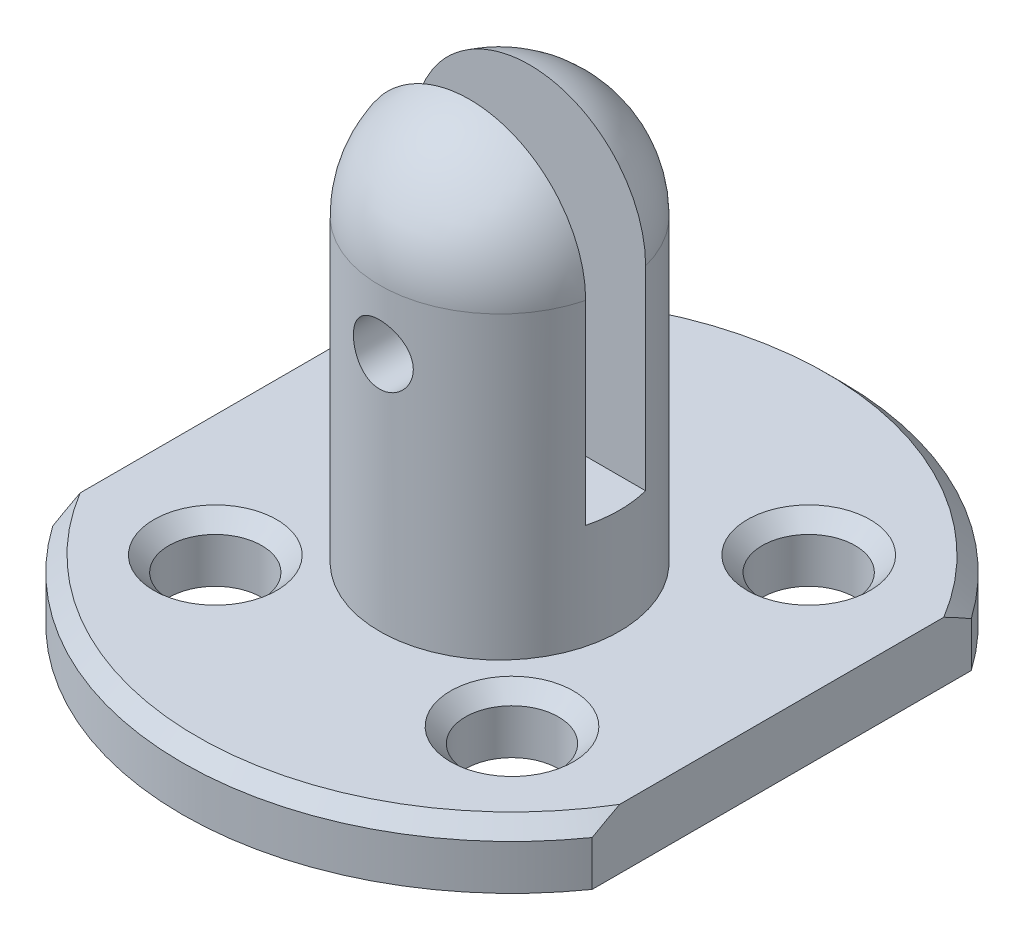
ISO-10303-21;
HEADER;
FILE_DESCRIPTION(('STEP AP214'),'2;1');
FILE_NAME('part.step','',(''),(''),'','','');
FILE_SCHEMA(('AUTOMOTIVE_DESIGN { 1 0 10303 214 1 1 1 1 }'));
ENDSEC;
DATA;
#1=APPLICATION_CONTEXT('core data for automotive mechanical design processes');
#2=APPLICATION_PROTOCOL_DEFINITION('international standard','automotive_design',2000,#1);
#3=PRODUCT_CONTEXT('',#1,'mechanical');
#4=PRODUCT('Part','Part','',(#3));
#5=PRODUCT_RELATED_PRODUCT_CATEGORY('part','',(#4));
#6=PRODUCT_DEFINITION_FORMATION('','',#4);
#7=PRODUCT_DEFINITION_CONTEXT('part definition',#1,'design');
#8=PRODUCT_DEFINITION('design','',#6,#7);
#9=PRODUCT_DEFINITION_SHAPE('','',#8);
#10=(LENGTH_UNIT() NAMED_UNIT(*) SI_UNIT(.MILLI.,.METRE.));
#11=(NAMED_UNIT(*) PLANE_ANGLE_UNIT() SI_UNIT($,.RADIAN.));
#12=(NAMED_UNIT(*) SI_UNIT($,.STERADIAN.) SOLID_ANGLE_UNIT());
#13=UNCERTAINTY_MEASURE_WITH_UNIT(LENGTH_MEASURE(1.E-05),#10,'distance_accuracy_value','');
#14=(GEOMETRIC_REPRESENTATION_CONTEXT(3) GLOBAL_UNCERTAINTY_ASSIGNED_CONTEXT((#13)) GLOBAL_UNIT_ASSIGNED_CONTEXT((#10,
#11,#12)) REPRESENTATION_CONTEXT('',''));
#15=CARTESIAN_POINT('',(0.,0.,0.));
#16=DIRECTION('',(0.,0.,1.));
#17=DIRECTION('',(1.,0.,0.));
#18=AXIS2_PLACEMENT_3D('',#15,#16,#17);
#19=CARTESIAN_POINT('',(5.3047232016726,12.,0.));
#20=DIRECTION('',(0.,1.,0.));
#21=DIRECTION('',(1.,0.,0.));
#22=AXIS2_PLACEMENT_3D('',#19,#20,#21);
#23=SPHERICAL_SURFACE('',#22,4.);
#24=CARTESIAN_POINT('',(5.3047232016726,12.,0.));
#25=DIRECTION('',(0.,1.,0.));
#26=DIRECTION('',(-1.,0.,0.));
#27=AXIS2_PLACEMENT_3D('',#24,#25,#26);
#28=CIRCLE('',#27,4.);
#29=CARTESIAN_POINT('',(9.17770654788001,12.,-1.));
#30=VERTEX_POINT('',#29);
#31=CARTESIAN_POINT('',(1.43173985546518,12.,-1.));
#32=VERTEX_POINT('',#31);
#33=EDGE_CURVE('E146',#30,#32,#28,.T.);
#34=ORIENTED_EDGE('',*,*,#33,.T.);
#35=CARTESIAN_POINT('',(5.3047232016726,12.,-1.));
#36=DIRECTION('',(0.,0.,-1.));
#37=DIRECTION('',(0.,1.,0.));
#38=AXIS2_PLACEMENT_3D('',#35,#36,#37);
#39=CIRCLE('',#38,3.87298334620742);
#40=EDGE_CURVE('E124',#32,#30,#39,.T.);
#41=ORIENTED_EDGE('',*,*,#40,.T.);
#42=EDGE_LOOP('',(#34,#41));
#43=FACE_BOUND('',#42,.T.);
#44=ADVANCED_FACE('F35',(#43),#23,.T.);
#45=CARTESIAN_POINT('',(5.3047232016726,2.,-0.414125848088417));
#46=DIRECTION('',(0.,-1.,0.));
#47=DIRECTION('',(0.,0.,-1.));
#48=AXIS2_PLACEMENT_3D('',#45,#46,#47);
#49=CYLINDRICAL_SURFACE('',#48,11.);
#50=DIRECTION('',(0.,-1.,0.));
#51=VECTOR('',#50,1.);
#52=CARTESIAN_POINT('',(-3.6952767983274,2.,-6.73868116842517));
#53=LINE('',#52,#51);
#54=CARTESIAN_POINT('',(-3.6952767983274,1.5,-6.73868116842517));
#55=VERTEX_POINT('',#54);
#56=CARTESIAN_POINT('',(-3.6952767983274,0.,-6.73868116842517));
#57=VERTEX_POINT('',#56);
#58=EDGE_CURVE('E187',#55,#57,#53,.T.);
#59=ORIENTED_EDGE('',*,*,#58,.F.);
#60=CARTESIAN_POINT('',(5.3047232016726,1.5,-0.414125848088417));
#61=DIRECTION('',(0.,1.,0.));
#62=DIRECTION('',(0.,0.,1.));
#63=AXIS2_PLACEMENT_3D('',#60,#61,#62);
#64=CIRCLE('',#63,11.);
#65=CARTESIAN_POINT('',(14.3047232016726,1.5,-6.73868116842518));
#66=VERTEX_POINT('',#65);
#67=EDGE_CURVE('E313',#55,#66,#64,.F.);
#68=ORIENTED_EDGE('',*,*,#67,.T.);
#69=DIRECTION('',(0.,-1.,0.));
#70=VECTOR('',#69,1.);
#71=CARTESIAN_POINT('',(14.3047232016726,2.,-6.73868116842518));
#72=LINE('',#71,#70);
#73=CARTESIAN_POINT('',(14.3047232016726,0.,-6.73868116842518));
#74=VERTEX_POINT('',#73);
#75=EDGE_CURVE('E171',#66,#74,#72,.T.);
#76=ORIENTED_EDGE('',*,*,#75,.T.);
#77=CARTESIAN_POINT('',(5.3047232016726,0.,-0.414125848088417));
#78=DIRECTION('',(0.,1.,0.));
#79=DIRECTION('',(0.,0.,1.));
#80=AXIS2_PLACEMENT_3D('',#77,#78,#79);
#81=CIRCLE('',#80,11.);
#82=EDGE_CURVE('E163',#74,#57,#81,.T.);
#83=ORIENTED_EDGE('',*,*,#82,.T.);
#84=EDGE_LOOP('',(#59,#68,#76,#83));
#85=FACE_BOUND('',#84,.T.);
#86=ADVANCED_FACE('F245',(#85),#49,.T.);
#87=CARTESIAN_POINT('',(-3.6952767983274,2.,5.91042947224834));
#88=DIRECTION('',(1.,0.,0.));
#89=DIRECTION('',(0.,0.,-1.));
#90=AXIS2_PLACEMENT_3D('',#87,#88,#89);
#91=PLANE('',#90);
#92=DIRECTION('',(0.,-1.,0.));
#93=VECTOR('',#92,1.);
#94=CARTESIAN_POINT('',(-3.69527679832741,2.,5.91042947224834));
#95=LINE('',#94,#93);
#96=CARTESIAN_POINT('',(-3.69527679832741,1.5,5.91042947224834));
#97=VERTEX_POINT('',#96);
#98=CARTESIAN_POINT('',(-3.69527679832741,0.,5.91042947224834));
#99=VERTEX_POINT('',#98);
#100=EDGE_CURVE('E185',#97,#99,#95,.T.);
#101=ORIENTED_EDGE('',*,*,#100,.F.);
#102=CARTESIAN_POINT('',(-3.69527679832741,1.5,5.91042947224834));
#103=CARTESIAN_POINT('',(-3.6952767983274,1.54336144120015,5.83501202660493));
#104=CARTESIAN_POINT('',(-3.6952767983274,1.58633376454159,5.75937019944279));
#105=CARTESIAN_POINT('',(-3.6952767983274,1.67144422351645,5.60763201809686));
#106=CARTESIAN_POINT('',(-3.6952767983274,1.71358246931803,5.53153572569244));
#107=CARTESIAN_POINT('',(-3.6952767983274,1.79698078713672,5.37886205559762));
#108=CARTESIAN_POINT('',(-3.6952767983274,1.83824085057838,5.30228467321883));
#109=CARTESIAN_POINT('',(-3.6952767983274,1.91983232897874,5.14862384085883));
#110=CARTESIAN_POINT('',(-3.6952767983274,1.96016361969474,5.07154032492386));
#111=CARTESIAN_POINT('',(-3.6952767983274,2.00000000000012,4.99420106510763));
#112=B_SPLINE_CURVE_WITH_KNOTS('',3,(#102,#103,#104,#105,#106,#107,#108,#109,#110,#111),
.UNSPECIFIED.,.F.,.F.,(4,2,2,2,4),(0.,0.260982516626926,0.521930328496994,0.782880687352906,
1.04386575332712),.UNSPECIFIED.);
#113=CARTESIAN_POINT('',(-3.6952767983274,2.,4.99420106510757));
#114=VERTEX_POINT('',#113);
#115=EDGE_CURVE('E254',#97,#114,#112,.T.);
#116=ORIENTED_EDGE('',*,*,#115,.T.);
#117=DIRECTION('',(0.,0.,1.));
#118=VECTOR('',#117,1.);
#119=CARTESIAN_POINT('',(-3.6952767983274,2.,5.91042947224834));
#120=LINE('',#119,#118);
#121=CARTESIAN_POINT('',(-3.6952767983274,2.,-5.8224527612844));
#122=VERTEX_POINT('',#121);
#123=EDGE_CURVE('E164',#122,#114,#120,.T.);
#124=ORIENTED_EDGE('',*,*,#123,.F.);
#125=CARTESIAN_POINT('',(-3.6952767983274,2.,-5.8224527612844));
#126=CARTESIAN_POINT('',(-3.6952767983274,1.9601636196947,-5.89979202110066));
#127=CARTESIAN_POINT('',(-3.6952767983274,1.91983232897873,-5.97687553703565));
#128=CARTESIAN_POINT('',(-3.6952767983274,1.8382408505784,-6.13053636939567));
#129=CARTESIAN_POINT('',(-3.6952767983274,1.79698078713673,-6.20711375177446));
#130=CARTESIAN_POINT('',(-3.6952767983274,1.71358246931802,-6.35978742186927));
#131=CARTESIAN_POINT('',(-3.6952767983274,1.67144422351644,-6.43588371427369));
#132=CARTESIAN_POINT('',(-3.6952767983274,1.5863337645416,-6.58762189561962));
#133=CARTESIAN_POINT('',(-3.6952767983274,1.54336144120018,-6.66326372278178));
#134=CARTESIAN_POINT('',(-3.6952767983274,1.50000000000006,-6.7386811684252));
#135=B_SPLINE_CURVE_WITH_KNOTS('',3,(#125,#126,#127,#128,#129,#130,#131,#132,#133,#134),
.UNSPECIFIED.,.F.,.F.,(4,2,2,2,4),(0.,0.260985065974222,0.521935424830138,0.782883236700206,
1.04386575332713),.UNSPECIFIED.);
#136=EDGE_CURVE('E60',#122,#55,#135,.T.);
#137=ORIENTED_EDGE('',*,*,#136,.T.);
#138=ORIENTED_EDGE('',*,*,#58,.T.);
#139=DIRECTION('',(0.,0.,1.));
#140=VECTOR('',#139,1.);
#141=CARTESIAN_POINT('',(-3.6952767983274,0.,5.91042947224834));
#142=LINE('',#141,#140);
#143=EDGE_CURVE('E174',#57,#99,#142,.T.);
#144=ORIENTED_EDGE('',*,*,#143,.T.);
#145=EDGE_LOOP('',(#101,#116,#124,#137,#138,#144));
#146=FACE_BOUND('',#145,.T.);
#147=ADVANCED_FACE('F240',(#146),#91,.F.);
#148=CARTESIAN_POINT('',(5.3047232016726,2.,-0.414125848088417));
#149=DIRECTION('',(0.,-1.,0.));
#150=DIRECTION('',(0.,0.,-1.));
#151=AXIS2_PLACEMENT_3D('',#148,#149,#150);
#152=CYLINDRICAL_SURFACE('',#151,11.);
#153=DIRECTION('',(0.,-1.,0.));
#154=VECTOR('',#153,1.);
#155=CARTESIAN_POINT('',(14.3047232016726,2.,5.91042947224834));
#156=LINE('',#155,#154);
#157=CARTESIAN_POINT('',(14.3047232016726,1.5,5.91042947224834));
#158=VERTEX_POINT('',#157);
#159=CARTESIAN_POINT('',(14.3047232016726,0.,5.91042947224834));
#160=VERTEX_POINT('',#159);
#161=EDGE_CURVE('E183',#158,#160,#156,.T.);
#162=ORIENTED_EDGE('',*,*,#161,.F.);
#163=CARTESIAN_POINT('',(5.3047232016726,1.5,-0.414125848088417));
#164=DIRECTION('',(0.,1.,0.));
#165=DIRECTION('',(0.,0.,1.));
#166=AXIS2_PLACEMENT_3D('',#163,#164,#165);
#167=CIRCLE('',#166,11.);
#168=EDGE_CURVE('E556',#158,#97,#167,.F.);
#169=ORIENTED_EDGE('',*,*,#168,.T.);
#170=ORIENTED_EDGE('',*,*,#100,.T.);
#171=CARTESIAN_POINT('',(5.3047232016726,0.,-0.414125848088417));
#172=DIRECTION('',(0.,1.,0.));
#173=DIRECTION('',(0.,0.,1.));
#174=AXIS2_PLACEMENT_3D('',#171,#172,#173);
#175=CIRCLE('',#174,11.);
#176=EDGE_CURVE('E177',#99,#160,#175,.T.);
#177=ORIENTED_EDGE('',*,*,#176,.T.);
#178=EDGE_LOOP('',(#162,#169,#170,#177));
#179=FACE_BOUND('',#178,.T.);
#180=ADVANCED_FACE('F233',(#179),#152,.T.);
#181=CARTESIAN_POINT('',(14.3047232016726,2.,5.91042947224834));
#182=DIRECTION('',(-1.,0.,0.));
#183=DIRECTION('',(0.,0.,1.));
#184=AXIS2_PLACEMENT_3D('',#181,#182,#183);
#185=PLANE('',#184);
#186=DIRECTION('',(0.,0.,-1.));
#187=VECTOR('',#186,1.);
#188=CARTESIAN_POINT('',(14.3047232016726,2.,5.91042947224834));
#189=LINE('',#188,#187);
#190=CARTESIAN_POINT('',(14.3047232016726,2.,4.99420106510757));
#191=VERTEX_POINT('',#190);
#192=CARTESIAN_POINT('',(14.3047232016726,2.,-5.8224527612844));
#193=VERTEX_POINT('',#192);
#194=EDGE_CURVE('E167',#191,#193,#189,.T.);
#195=ORIENTED_EDGE('',*,*,#194,.F.);
#196=CARTESIAN_POINT('',(14.3047232016726,2.,4.99420106510757));
#197=CARTESIAN_POINT('',(14.3047232016726,1.9601636196947,5.07154032492384));
#198=CARTESIAN_POINT('',(14.3047232016726,1.91983232897873,5.14862384085882));
#199=CARTESIAN_POINT('',(14.3047232016726,1.8382408505784,5.30228467321885));
#200=CARTESIAN_POINT('',(14.3047232016726,1.79698078713673,5.37886205559763));
#201=CARTESIAN_POINT('',(14.3047232016726,1.71358246931802,5.53153572569244));
#202=CARTESIAN_POINT('',(14.3047232016726,1.67144422351644,5.60763201809687));
#203=CARTESIAN_POINT('',(14.3047232016726,1.5863337645416,5.7593701994428));
#204=CARTESIAN_POINT('',(14.3047232016726,1.54336144120018,5.83501202660495));
#205=CARTESIAN_POINT('',(14.3047232016726,1.50000000000006,5.91042947224837));
#206=B_SPLINE_CURVE_WITH_KNOTS('',3,(#196,#197,#198,#199,#200,#201,#202,#203,#204,#205),
.UNSPECIFIED.,.F.,.F.,(4,2,2,2,4),(0.,0.260985065974222,0.521935424830137,0.782883236700204,
1.04386575332713),.UNSPECIFIED.);
#207=EDGE_CURVE('E220',#191,#158,#206,.T.);
#208=ORIENTED_EDGE('',*,*,#207,.T.);
#209=ORIENTED_EDGE('',*,*,#161,.T.);
#210=DIRECTION('',(0.,0.,-1.));
#211=VECTOR('',#210,1.);
#212=CARTESIAN_POINT('',(14.3047232016726,0.,5.91042947224834));
#213=LINE('',#212,#211);
#214=EDGE_CURVE('E168',#160,#74,#213,.T.);
#215=ORIENTED_EDGE('',*,*,#214,.T.);
#216=ORIENTED_EDGE('',*,*,#75,.F.);
#217=CARTESIAN_POINT('',(14.3047232016726,1.5,-6.73868116842518));
#218=CARTESIAN_POINT('',(14.3047232016726,1.54336144120015,-6.66326372278177));
#219=CARTESIAN_POINT('',(14.3047232016726,1.58633376454159,-6.58762189561963));
#220=CARTESIAN_POINT('',(14.3047232016726,1.67144422351644,-6.4358837142737));
#221=CARTESIAN_POINT('',(14.3047232016726,1.71358246931803,-6.35978742186928));
#222=CARTESIAN_POINT('',(14.3047232016726,1.79698078713672,-6.20711375177446));
#223=CARTESIAN_POINT('',(14.3047232016726,1.83824085057838,-6.13053636939567));
#224=CARTESIAN_POINT('',(14.3047232016726,1.91983232897874,-5.97687553703567));
#225=CARTESIAN_POINT('',(14.3047232016726,1.96016361969474,-5.8997920211007));
#226=CARTESIAN_POINT('',(14.3047232016726,2.00000000000012,-5.82245276128447));
#227=B_SPLINE_CURVE_WITH_KNOTS('',3,(#217,#218,#219,#220,#221,#222,#223,#224,#225,#226),
.UNSPECIFIED.,.F.,.F.,(4,2,2,2,4),(0.,0.260982516626927,0.521930328496995,0.782880687352908,
1.04386575332713),.UNSPECIFIED.);
#228=EDGE_CURVE('E213',#66,#193,#227,.T.);
#229=ORIENTED_EDGE('',*,*,#228,.T.);
#230=EDGE_LOOP('',(#195,#208,#209,#215,#216,#229));
#231=FACE_BOUND('',#230,.T.);
#232=ADVANCED_FACE('F227',(#231),#185,.F.);
#233=CARTESIAN_POINT('',(5.3047232016726,2.,-0.414125848088417));
#234=DIRECTION('',(0.,1.,0.));
#235=DIRECTION('',(0.,0.,1.));
#236=AXIS2_PLACEMENT_3D('',#233,#234,#235);
#237=PLANE('',#236);
#238=CARTESIAN_POINT('',(5.3047232016726,2.,0.));
#239=DIRECTION('',(0.,1.,0.));
#240=DIRECTION('',(-1.,0.,0.));
#241=AXIS2_PLACEMENT_3D('',#238,#239,#240);
#242=CIRCLE('',#241,4.);
#243=CARTESIAN_POINT('',(1.3047232016726,2.,0.));
#244=VERTEX_POINT('',#243);
#245=EDGE_CURVE('E148',#244,#244,#242,.T.);
#246=ORIENTED_EDGE('',*,*,#245,.F.);
#247=EDGE_LOOP('',(#246));
#248=FACE_BOUND('',#247,.T.);
#249=CARTESIAN_POINT('',(0.35497573336682,2.,-5.36387331639417));
#250=DIRECTION('',(0.,1.,0.));
#251=DIRECTION('',(0.,0.,1.));
#252=AXIS2_PLACEMENT_3D('',#249,#250,#251);
#253=CIRCLE('',#252,2.05);
#254=CARTESIAN_POINT('',(0.35497573336682,2.,-3.31387331639417));
#255=VERTEX_POINT('',#254);
#256=EDGE_CURVE('E207',#255,#255,#253,.F.);
#257=ORIENTED_EDGE('',*,*,#256,.T.);
#258=EDGE_LOOP('',(#257));
#259=FACE_BOUND('',#258,.T.);
#260=CARTESIAN_POINT('',(10.2544706699785,2.,4.53562162021744));
#261=DIRECTION('',(0.,1.,0.));
#262=DIRECTION('',(0.,0.,1.));
#263=AXIS2_PLACEMENT_3D('',#260,#261,#262);
#264=CIRCLE('',#263,2.05);
#265=CARTESIAN_POINT('',(10.2544706699785,2.,6.58562162021744));
#266=VERTEX_POINT('',#265);
#267=EDGE_CURVE('E204',#266,#266,#264,.F.);
#268=ORIENTED_EDGE('',*,*,#267,.T.);
#269=EDGE_LOOP('',(#268));
#270=FACE_BOUND('',#269,.T.);
#271=CARTESIAN_POINT('',(0.354975733366854,2.,4.53562162021751));
#272=DIRECTION('',(0.,1.,0.));
#273=DIRECTION('',(0.,0.,1.));
#274=AXIS2_PLACEMENT_3D('',#271,#272,#273);
#275=CIRCLE('',#274,2.05);
#276=CARTESIAN_POINT('',(0.354975733366854,2.,6.58562162021751));
#277=VERTEX_POINT('',#276);
#278=EDGE_CURVE('E198',#277,#277,#275,.F.);
#279=ORIENTED_EDGE('',*,*,#278,.T.);
#280=EDGE_LOOP('',(#279));
#281=FACE_BOUND('',#280,.T.);
#282=CARTESIAN_POINT('',(10.2544706699784,2.,-5.36387331639424));
#283=DIRECTION('',(0.,1.,0.));
#284=DIRECTION('',(0.,0.,1.));
#285=AXIS2_PLACEMENT_3D('',#282,#283,#284);
#286=CIRCLE('',#285,2.05);
#287=CARTESIAN_POINT('',(10.2544706699784,2.,-3.31387331639424));
#288=VERTEX_POINT('',#287);
#289=EDGE_CURVE('E195',#288,#288,#286,.F.);
#290=ORIENTED_EDGE('',*,*,#289,.T.);
#291=EDGE_LOOP('',(#290));
#292=FACE_BOUND('',#291,.T.);
#293=ORIENTED_EDGE('',*,*,#123,.T.);
#294=CARTESIAN_POINT('',(5.3047232016726,2.,-0.414125848088417));
#295=DIRECTION('',(0.,1.,0.));
#296=DIRECTION('',(0.,0.,1.));
#297=AXIS2_PLACEMENT_3D('',#294,#295,#296);
#298=CIRCLE('',#297,10.5);
#299=EDGE_CURVE('E201',#114,#191,#298,.T.);
#300=ORIENTED_EDGE('',*,*,#299,.T.);
#301=ORIENTED_EDGE('',*,*,#194,.T.);
#302=CARTESIAN_POINT('',(5.3047232016726,2.,-0.414125848088417));
#303=DIRECTION('',(0.,1.,0.));
#304=DIRECTION('',(0.,0.,1.));
#305=AXIS2_PLACEMENT_3D('',#302,#303,#304);
#306=CIRCLE('',#305,10.5);
#307=EDGE_CURVE('E192',#193,#122,#306,.T.);
#308=ORIENTED_EDGE('',*,*,#307,.T.);
#309=EDGE_LOOP('',(#293,#300,#301,#308));
#310=FACE_BOUND('',#309,.T.);
#311=ADVANCED_FACE('F232',(#248,#259,#270,#281,#292,#310),#237,.T.);
#312=CARTESIAN_POINT('',(5.3047232016726,0.,-0.414125848088417));
#313=DIRECTION('',(0.,1.,0.));
#314=DIRECTION('',(0.,0.,1.));
#315=AXIS2_PLACEMENT_3D('',#312,#313,#314);
#316=PLANE('',#315);
#317=CARTESIAN_POINT('',(5.3047232016726,0.,-0.414125848088417));
#318=DIRECTION('',(0.,1.,0.));
#319=DIRECTION('',(0.,0.,1.));
#320=AXIS2_PLACEMENT_3D('',#317,#318,#319);
#321=CIRCLE('',#320,3.);
#322=CARTESIAN_POINT('',(5.3047232016726,0.,2.58587415191158));
#323=VERTEX_POINT('',#322);
#324=EDGE_CURVE('E11',#323,#323,#321,.F.);
#325=ORIENTED_EDGE('',*,*,#324,.F.);
#326=EDGE_LOOP('',(#325));
#327=FACE_BOUND('',#326,.T.);
#328=CARTESIAN_POINT('',(0.35497573336682,0.,-5.36387331639417));
#329=DIRECTION('',(0.,1.,0.));
#330=DIRECTION('',(0.,0.,1.));
#331=AXIS2_PLACEMENT_3D('',#328,#329,#330);
#332=CIRCLE('',#331,1.55);
#333=CARTESIAN_POINT('',(0.35497573336682,0.,-3.81387331639417));
#334=VERTEX_POINT('',#333);
#335=EDGE_CURVE('E151',#334,#334,#332,.T.);
#336=ORIENTED_EDGE('',*,*,#335,.T.);
#337=EDGE_LOOP('',(#336));
#338=FACE_BOUND('',#337,.T.);
#339=CARTESIAN_POINT('',(0.354975733366854,0.,4.53562162021751));
#340=DIRECTION('',(0.,1.,0.));
#341=DIRECTION('',(0.,0.,1.));
#342=AXIS2_PLACEMENT_3D('',#339,#340,#341);
#343=CIRCLE('',#342,1.55);
#344=CARTESIAN_POINT('',(0.354975733366854,0.,6.08562162021751));
#345=VERTEX_POINT('',#344);
#346=EDGE_CURVE('E156',#345,#345,#343,.T.);
#347=ORIENTED_EDGE('',*,*,#346,.T.);
#348=EDGE_LOOP('',(#347));
#349=FACE_BOUND('',#348,.T.);
#350=CARTESIAN_POINT('',(10.2544706699785,0.,4.53562162021744));
#351=DIRECTION('',(0.,1.,0.));
#352=DIRECTION('',(0.,0.,1.));
#353=AXIS2_PLACEMENT_3D('',#350,#351,#352);
#354=CIRCLE('',#353,1.55);
#355=CARTESIAN_POINT('',(10.2544706699785,0.,6.08562162021744));
#356=VERTEX_POINT('',#355);
#357=EDGE_CURVE('E152',#356,#356,#354,.T.);
#358=ORIENTED_EDGE('',*,*,#357,.T.);
#359=EDGE_LOOP('',(#358));
#360=FACE_BOUND('',#359,.T.);
#361=CARTESIAN_POINT('',(10.2544706699784,0.,-5.36387331639424));
#362=DIRECTION('',(0.,1.,0.));
#363=DIRECTION('',(0.,0.,1.));
#364=AXIS2_PLACEMENT_3D('',#361,#362,#363);
#365=CIRCLE('',#364,1.55);
#366=CARTESIAN_POINT('',(10.2544706699784,0.,-3.81387331639424));
#367=VERTEX_POINT('',#366);
#368=EDGE_CURVE('E155',#367,#367,#365,.T.);
#369=ORIENTED_EDGE('',*,*,#368,.T.);
#370=EDGE_LOOP('',(#369));
#371=FACE_BOUND('',#370,.T.);
#372=ORIENTED_EDGE('',*,*,#82,.F.);
#373=ORIENTED_EDGE('',*,*,#214,.F.);
#374=ORIENTED_EDGE('',*,*,#176,.F.);
#375=ORIENTED_EDGE('',*,*,#143,.F.);
#376=EDGE_LOOP('',(#372,#373,#374,#375));
#377=FACE_BOUND('',#376,.T.);
#378=ADVANCED_FACE('F235',(#327,#338,#349,#360,#371,#377),#316,.F.);
#379=CARTESIAN_POINT('',(10.2544706699784,0.,-5.36387331639424));
#380=DIRECTION('',(0.,1.,0.));
#381=DIRECTION('',(0.,0.,1.));
#382=AXIS2_PLACEMENT_3D('',#379,#380,#381);
#383=CYLINDRICAL_SURFACE('',#382,1.55);
#384=CARTESIAN_POINT('',(10.2544706699784,1.5,-5.36387331639424));
#385=DIRECTION('',(0.,1.,0.));
#386=DIRECTION('',(0.,0.,1.));
#387=AXIS2_PLACEMENT_3D('',#384,#385,#386);
#388=CIRCLE('',#387,1.55);
#389=CARTESIAN_POINT('',(10.2544706699784,1.5,-3.81387331639424));
#390=VERTEX_POINT('',#389);
#391=EDGE_CURVE('E317',#390,#390,#388,.T.);
#392=ORIENTED_EDGE('',*,*,#391,.T.);
#393=EDGE_LOOP('',(#392));
#394=FACE_BOUND('',#393,.T.);
#395=ORIENTED_EDGE('',*,*,#368,.F.);
#396=EDGE_LOOP('',(#395));
#397=FACE_BOUND('',#396,.T.);
#398=ADVANCED_FACE('F486',(#394,#397),#383,.F.);
#399=CARTESIAN_POINT('',(10.2544706699785,0.,4.53562162021744));
#400=DIRECTION('',(0.,1.,0.));
#401=DIRECTION('',(0.,0.,1.));
#402=AXIS2_PLACEMENT_3D('',#399,#400,#401);
#403=CYLINDRICAL_SURFACE('',#402,1.55);
#404=CARTESIAN_POINT('',(10.2544706699785,1.5,4.53562162021744));
#405=DIRECTION('',(0.,1.,0.));
#406=DIRECTION('',(0.,0.,1.));
#407=AXIS2_PLACEMENT_3D('',#404,#405,#406);
#408=CIRCLE('',#407,1.55);
#409=CARTESIAN_POINT('',(10.2544706699785,1.5,6.08562162021744));
#410=VERTEX_POINT('',#409);
#411=EDGE_CURVE('E210',#410,#410,#408,.T.);
#412=ORIENTED_EDGE('',*,*,#411,.T.);
#413=EDGE_LOOP('',(#412));
#414=FACE_BOUND('',#413,.T.);
#415=ORIENTED_EDGE('',*,*,#357,.F.);
#416=EDGE_LOOP('',(#415));
#417=FACE_BOUND('',#416,.T.);
#418=ADVANCED_FACE('F477',(#414,#417),#403,.F.);
#419=CARTESIAN_POINT('',(0.354975733366854,0.,4.53562162021751));
#420=DIRECTION('',(0.,1.,0.));
#421=DIRECTION('',(0.,0.,1.));
#422=AXIS2_PLACEMENT_3D('',#419,#420,#421);
#423=CYLINDRICAL_SURFACE('',#422,1.55);
#424=CARTESIAN_POINT('',(0.354975733366854,1.5,4.53562162021751));
#425=DIRECTION('',(0.,1.,0.));
#426=DIRECTION('',(0.,0.,1.));
#427=AXIS2_PLACEMENT_3D('',#424,#425,#426);
#428=CIRCLE('',#427,1.55);
#429=CARTESIAN_POINT('',(0.354975733366854,1.5,6.08562162021751));
#430=VERTEX_POINT('',#429);
#431=EDGE_CURVE('E260',#430,#430,#428,.T.);
#432=ORIENTED_EDGE('',*,*,#431,.T.);
#433=EDGE_LOOP('',(#432));
#434=FACE_BOUND('',#433,.T.);
#435=ORIENTED_EDGE('',*,*,#346,.F.);
#436=EDGE_LOOP('',(#435));
#437=FACE_BOUND('',#436,.T.);
#438=ADVANCED_FACE('F468',(#434,#437),#423,.F.);
#439=CARTESIAN_POINT('',(0.35497573336682,0.,-5.36387331639417));
#440=DIRECTION('',(0.,1.,0.));
#441=DIRECTION('',(0.,0.,1.));
#442=AXIS2_PLACEMENT_3D('',#439,#440,#441);
#443=CYLINDRICAL_SURFACE('',#442,1.55);
#444=CARTESIAN_POINT('',(0.35497573336682,1.5,-5.36387331639417));
#445=DIRECTION('',(0.,1.,0.));
#446=DIRECTION('',(0.,0.,1.));
#447=AXIS2_PLACEMENT_3D('',#444,#445,#446);
#448=CIRCLE('',#447,1.55);
#449=CARTESIAN_POINT('',(0.35497573336682,1.5,-3.81387331639417));
#450=VERTEX_POINT('',#449);
#451=EDGE_CURVE('E189',#450,#450,#448,.T.);
#452=ORIENTED_EDGE('',*,*,#451,.T.);
#453=EDGE_LOOP('',(#452));
#454=FACE_BOUND('',#453,.T.);
#455=ORIENTED_EDGE('',*,*,#335,.F.);
#456=EDGE_LOOP('',(#455));
#457=FACE_BOUND('',#456,.T.);
#458=ADVANCED_FACE('F460',(#454,#457),#443,.F.);
#459=CARTESIAN_POINT('',(0.35497573336682,1.5,-5.36387331639417));
#460=DIRECTION('',(0.,1.,0.));
#461=DIRECTION('',(0.,0.,1.));
#462=AXIS2_PLACEMENT_3D('',#459,#460,#461);
#463=CONICAL_SURFACE('',#462,1.55,0.78539816339745);
#464=ORIENTED_EDGE('',*,*,#256,.F.);
#465=EDGE_LOOP('',(#464));
#466=FACE_BOUND('',#465,.T.);
#467=ORIENTED_EDGE('',*,*,#451,.F.);
#468=EDGE_LOOP('',(#467));
#469=FACE_BOUND('',#468,.T.);
#470=ADVANCED_FACE('F452',(#466,#469),#463,.F.);
#471=CARTESIAN_POINT('',(10.2544706699785,1.5,4.53562162021744));
#472=DIRECTION('',(0.,1.,0.));
#473=DIRECTION('',(0.,0.,1.));
#474=AXIS2_PLACEMENT_3D('',#471,#472,#473);
#475=CONICAL_SURFACE('',#474,1.55,0.78539816339745);
#476=ORIENTED_EDGE('',*,*,#267,.F.);
#477=EDGE_LOOP('',(#476));
#478=FACE_BOUND('',#477,.T.);
#479=ORIENTED_EDGE('',*,*,#411,.F.);
#480=EDGE_LOOP('',(#479));
#481=FACE_BOUND('',#480,.T.);
#482=ADVANCED_FACE('F273',(#478,#481),#475,.F.);
#483=CARTESIAN_POINT('',(5.3047232016726,2.,-0.414125848088417));
#484=DIRECTION('',(0.,-1.,0.));
#485=DIRECTION('',(0.,0.,-1.));
#486=AXIS2_PLACEMENT_3D('',#483,#484,#485);
#487=CONICAL_SURFACE('',#486,10.5,0.785398163397448);
#488=ORIENTED_EDGE('',*,*,#115,.F.);
#489=ORIENTED_EDGE('',*,*,#168,.F.);
#490=ORIENTED_EDGE('',*,*,#207,.F.);
#491=ORIENTED_EDGE('',*,*,#299,.F.);
#492=EDGE_LOOP('',(#488,#489,#490,#491));
#493=FACE_BOUND('',#492,.T.);
#494=ADVANCED_FACE('F263',(#493),#487,.T.);
#495=CARTESIAN_POINT('',(0.354975733366854,1.5,4.53562162021751));
#496=DIRECTION('',(0.,1.,0.));
#497=DIRECTION('',(0.,0.,1.));
#498=AXIS2_PLACEMENT_3D('',#495,#496,#497);
#499=CONICAL_SURFACE('',#498,1.55,0.78539816339745);
#500=ORIENTED_EDGE('',*,*,#278,.F.);
#501=EDGE_LOOP('',(#500));
#502=FACE_BOUND('',#501,.T.);
#503=ORIENTED_EDGE('',*,*,#431,.F.);
#504=EDGE_LOOP('',(#503));
#505=FACE_BOUND('',#504,.T.);
#506=ADVANCED_FACE('F272',(#502,#505),#499,.F.);
#507=CARTESIAN_POINT('',(10.2544706699784,1.5,-5.36387331639424));
#508=DIRECTION('',(0.,1.,0.));
#509=DIRECTION('',(0.,0.,1.));
#510=AXIS2_PLACEMENT_3D('',#507,#508,#509);
#511=CONICAL_SURFACE('',#510,1.55,0.78539816339745);
#512=ORIENTED_EDGE('',*,*,#289,.F.);
#513=EDGE_LOOP('',(#512));
#514=FACE_BOUND('',#513,.T.);
#515=ORIENTED_EDGE('',*,*,#391,.F.);
#516=EDGE_LOOP('',(#515));
#517=FACE_BOUND('',#516,.T.);
#518=ADVANCED_FACE('F280',(#514,#517),#511,.F.);
#519=CARTESIAN_POINT('',(5.3047232016726,2.,-0.414125848088417));
#520=DIRECTION('',(0.,-1.,0.));
#521=DIRECTION('',(0.,0.,-1.));
#522=AXIS2_PLACEMENT_3D('',#519,#520,#521);
#523=CONICAL_SURFACE('',#522,10.5,0.785398163397448);
#524=ORIENTED_EDGE('',*,*,#228,.F.);
#525=ORIENTED_EDGE('',*,*,#67,.F.);
#526=ORIENTED_EDGE('',*,*,#136,.F.);
#527=ORIENTED_EDGE('',*,*,#307,.F.);
#528=EDGE_LOOP('',(#524,#525,#526,#527));
#529=FACE_BOUND('',#528,.T.);
#530=ADVANCED_FACE('F38',(#529),#523,.T.);
#531=CARTESIAN_POINT('',(5.3047232016726,16.,0.));
#532=DIRECTION('',(0.,1.,0.));
#533=DIRECTION('',(-1.,0.,0.));
#534=AXIS2_PLACEMENT_3D('',#531,#532,#533);
#535=CYLINDRICAL_SURFACE('',#534,4.);
#536=CARTESIAN_POINT('',(6.3,10.,-3.87419980056671));
#537=CARTESIAN_POINT('',(6.29999843201426,10.0552310616155,-3.87420085273871));
#538=CARTESIAN_POINT('',(6.29540873381393,10.1104794864667,-3.87538816378024));
#539=CARTESIAN_POINT('',(6.27720021197294,10.219390109964,-3.87999660150357));
#540=CARTESIAN_POINT('',(6.26357613655622,10.2730513670088,-3.88341902746304));
#541=CARTESIAN_POINT('',(6.22776656408013,10.3771968884106,-3.89208522198603));
#542=CARTESIAN_POINT('',(6.20559204393723,10.4276851299763,-3.89732665448059));
#543=CARTESIAN_POINT('',(6.15334414359826,10.5242305639147,-3.9090352059017));
#544=CARTESIAN_POINT('',(6.12327043464092,10.570287571752,-3.91550237583986));
#545=CARTESIAN_POINT('',(6.055376691045,10.6576678038288,-3.9290887177041));
#546=CARTESIAN_POINT('',(6.01741592809534,10.6988801007915,-3.93621821193236));
#547=CARTESIAN_POINT('',(5.9351284760036,10.7744235457819,-3.95023141768916));
#548=CARTESIAN_POINT('',(5.89080120253864,10.8087540615011,-3.95711510658503));
#549=CARTESIAN_POINT('',(5.79628639304042,10.8700077206399,-3.96997072503624));
#550=CARTESIAN_POINT('',(5.74602696647831,10.8968230748125,-3.97592888931576));
#551=CARTESIAN_POINT('',(5.64154013138293,10.9415833184378,-3.98613919546751));
#552=CARTESIAN_POINT('',(5.58731331191331,10.9595295216927,-3.99039159000067));
#553=CARTESIAN_POINT('',(5.47760013344347,10.9856843037843,-3.99663232907768));
#554=CARTESIAN_POINT('',(5.42216169866394,10.9940831849907,-3.99866488704896));
#555=CARTESIAN_POINT('',(5.31062837998386,11.0015036448142,-4.00038420258252));
#556=CARTESIAN_POINT('',(5.25453359342498,11.0005265967756,-4.00007130369831));
#557=CARTESIAN_POINT('',(5.14458413928902,10.9893597769463,-3.99716342054309));
#558=CARTESIAN_POINT('',(5.09070733458529,10.9793729791192,-3.99461874923037));
#559=CARTESIAN_POINT('',(4.98542136943228,10.9507977038286,-3.98758472049669));
#560=CARTESIAN_POINT('',(4.93401234384127,10.9322087568675,-3.98309525693154));
#561=CARTESIAN_POINT('',(4.83456682966027,10.886785381001,-3.97259092102761));
#562=CARTESIAN_POINT('',(4.78656613116402,10.8598759149554,-3.96656225763224));
#563=CARTESIAN_POINT('',(4.69569042051908,10.7986323256448,-3.9536298511448));
#564=CARTESIAN_POINT('',(4.6528163070324,10.764296903605,-3.94672595506499));
#565=CARTESIAN_POINT('',(4.57218376400027,10.6880726703714,-3.93257031388267));
#566=CARTESIAN_POINT('',(4.53459591005173,10.6460040319444,-3.9253142139924));
#567=CARTESIAN_POINT('',(4.46697126114642,10.5560826919703,-3.9114404954559));
#568=CARTESIAN_POINT('',(4.43693481356928,10.5082297244825,-3.90482290619105));
#569=CARTESIAN_POINT('',(4.38516199815215,10.407772630745,-3.89295764243522));
#570=CARTESIAN_POINT('',(4.36346517482106,10.3551472959737,-3.88771653113888));
#571=CARTESIAN_POINT('',(4.32928012511098,10.2468323629557,-3.87928140166929));
#572=CARTESIAN_POINT('',(4.31678990626173,10.1911434305304,-3.87608694058471));
#573=CARTESIAN_POINT('',(4.30165748441124,10.0798760277753,-3.87219822119545));
#574=CARTESIAN_POINT('',(4.29876118261766,10.0243343271931,-3.87143946931759));
#575=CARTESIAN_POINT('',(4.30220329133153,9.91356119881482,-3.87233224437661));
#576=CARTESIAN_POINT('',(4.30854084547507,9.85832974272311,-3.87398354780078));
#577=CARTESIAN_POINT('',(4.33004867012127,9.75068469675403,-3.87944944986021));
#578=CARTESIAN_POINT('',(4.3450716297083,9.69823966584836,-3.88322794240468));
#579=CARTESIAN_POINT('',(4.38336043965391,9.5966124906273,-3.89248971441114));
#580=CARTESIAN_POINT('',(4.40662727131661,9.54743073558171,-3.89797319681602));
#581=CARTESIAN_POINT('',(4.46127329400344,9.45265291653265,-3.91016475531222));
#582=CARTESIAN_POINT('',(4.49280387156381,9.40714704068512,-3.91689491227096));
#583=CARTESIAN_POINT('',(4.56289039534227,9.32197932159689,-3.93077061948281));
#584=CARTESIAN_POINT('',(4.60144750681526,9.28231844964654,-3.93791623850061));
#585=CARTESIAN_POINT('',(4.6856580639537,9.20893699753424,-3.95204039518816));
#586=CARTESIAN_POINT('',(4.73146641146769,9.17539216219861,-3.9590101272758));
#587=CARTESIAN_POINT('',(4.82821234646027,9.11647092485668,-3.97181504364299));
#588=CARTESIAN_POINT('',(4.87914967301367,9.09109410759632,-3.97765028559294));
#589=CARTESIAN_POINT('',(4.98436477166655,9.04944650806157,-3.98749790489448));
#590=CARTESIAN_POINT('',(5.03861588466683,9.03311154803515,-3.99152309041359));
#591=CARTESIAN_POINT('',(5.14920804009434,9.0098215436697,-3.99735883931965));
#592=CARTESIAN_POINT('',(5.20554867531117,9.0028646814749,-3.99916983190067));
#593=CARTESIAN_POINT('',(5.3170802457388,8.99863186926963,-4.00035921691191));
#594=CARTESIAN_POINT('',(5.37226085515598,9.0010981608741,-3.99980233197784));
#595=CARTESIAN_POINT('',(5.4813970006131,9.01505262806728,-3.99646934716064));
#596=CARTESIAN_POINT('',(5.53535257477712,9.02654052249931,-3.99369331643675));
#597=CARTESIAN_POINT('',(5.64022336637681,9.05807115583973,-3.98625012970909));
#598=CARTESIAN_POINT('',(5.69115402093067,9.07806525924432,-3.98159373255091));
#599=CARTESIAN_POINT('',(5.78896733109128,9.12599866005523,-3.97088544913466));
#600=CARTESIAN_POINT('',(5.83584948004722,9.15393895001513,-3.96483338856295));
#601=CARTESIAN_POINT('',(5.92544220041684,9.21774802645048,-3.95181070470094));
#602=CARTESIAN_POINT('',(5.96802708234997,9.25378953003747,-3.94482166252161));
#603=CARTESIAN_POINT('',(6.04663193293359,9.33244250074272,-3.93079752057187));
#604=CARTESIAN_POINT('',(6.08265023677615,9.3750556289077,-3.92376240958877));
#605=CARTESIAN_POINT('',(6.14776102250869,9.4666006371002,-3.91029614413786));
#606=CARTESIAN_POINT('',(6.17671138142237,9.51563578489267,-3.90387874532284));
#607=CARTESIAN_POINT('',(6.22591541420274,9.61802903656608,-3.89256301302691));
#608=CARTESIAN_POINT('',(6.24617539246309,9.67138397316069,-3.88766357906491));
#609=CARTESIAN_POINT('',(6.274413426012,9.77053654051903,-3.88070464095252));
#610=CARTESIAN_POINT('',(6.28398750832907,9.81586082506667,-3.8782837339457));
#611=CARTESIAN_POINT('',(6.29678118360109,9.90745272941705,-3.87503094010975));
#612=CARTESIAN_POINT('',(6.30000131386137,9.95372026912156,-3.87419891892085));
#613=CARTESIAN_POINT('',(6.3,10.,-3.87419980056671));
#614=B_SPLINE_CURVE_WITH_KNOTS('',3,(#536,#537,#538,#539,#540,#541,#542,#543,#544,#545,#546,
#547,#548,#549,#550,#551,#552,#553,#554,#555,#556,#557,#558,#559,#560,#561,#562,#563,#564,#565,
#566,#567,#568,#569,#570,#571,#572,#573,#574,#575,#576,#577,#578,#579,#580,#581,#582,#583,#584,
#585,#586,#587,#588,#589,#590,#591,#592,#593,#594,#595,#596,#597,#598,#599,#600,#601,#602,#603,
#604,#605,#606,#607,#608,#609,#610,#611,#612,#613),.UNSPECIFIED.,.T.,.F.,(4,2,2,2,2,2,2,2,2,2,2,
2,2,2,2,2,2,2,2,2,2,2,2,2,2,2,2,2,2,2,2,2,2,2,2,2,2,2,4),(0.,0.165523267737636,
0.331142840296078,0.496550497347541,0.661965039694887,0.830633131610027,0.99931671390722,
1.17030852822731,1.34127500564547,1.50877040726292,1.67624127527751,1.8400310202815,
2.0038297058399,2.16915092952713,2.33450109075775,2.50434231478592,2.67419135041731,
2.84483611608562,3.01544394038968,3.18149540369609,3.34753146808014,3.51083077091716,
3.67414951851774,3.84069932814515,4.00727678296529,4.17807009186893,4.34885471643573,
4.51841106265572,4.68793453724971,4.85285454424853,5.01776941174819,5.18175376525298,
5.34575861095221,5.51366292962934,5.68160975764565,5.85269749311731,6.02366090306331,
6.16236944718354,6.30106626127602),.UNSPECIFIED.);
#615=CARTESIAN_POINT('',(6.3,10.,-3.87419980056671));
#616=VERTEX_POINT('',#615);
#617=EDGE_CURVE('E129',#616,#616,#614,.T.);
#618=ORIENTED_EDGE('',*,*,#617,.T.);
#619=EDGE_LOOP('',(#618));
#620=FACE_BOUND('',#619,.T.);
#621=CARTESIAN_POINT('',(6.3,10.,3.87419980056671));
#622=CARTESIAN_POINT('',(6.29999843201426,9.94476893838448,3.87420085273871));
#623=CARTESIAN_POINT('',(6.29540873381393,9.88952051353329,3.87538816378024));
#624=CARTESIAN_POINT('',(6.27720021197294,9.78060989003601,3.87999660150357));
#625=CARTESIAN_POINT('',(6.26357613655622,9.72694863299117,3.88341902746304));
#626=CARTESIAN_POINT('',(6.22776656408013,9.62280311158942,3.89208522198603));
#627=CARTESIAN_POINT('',(6.20559204393723,9.5723148700237,3.89732665448059));
#628=CARTESIAN_POINT('',(6.15334414359826,9.47576943608533,3.9090352059017));
#629=CARTESIAN_POINT('',(6.12327043464092,9.429712428248,3.91550237583986));
#630=CARTESIAN_POINT('',(6.055376691045,9.34233219617124,3.9290887177041));
#631=CARTESIAN_POINT('',(6.01741592809534,9.30111989920846,3.93621821193236));
#632=CARTESIAN_POINT('',(5.9351284760036,9.22557645421811,3.95023141768916));
#633=CARTESIAN_POINT('',(5.89080120253864,9.19124593849894,3.95711510658503));
#634=CARTESIAN_POINT('',(5.79628639304042,9.12999227936007,3.96997072503624));
#635=CARTESIAN_POINT('',(5.74602696647831,9.10317692518747,3.97592888931576));
#636=CARTESIAN_POINT('',(5.64154013138293,9.05841668156217,3.98613919546751));
#637=CARTESIAN_POINT('',(5.58731331191331,9.04047047830728,3.99039159000067));
#638=CARTESIAN_POINT('',(5.47760013344347,9.01431569621569,3.99663232907768));
#639=CARTESIAN_POINT('',(5.42216169866394,9.00591681500931,3.99866488704896));
#640=CARTESIAN_POINT('',(5.31062837998386,8.99849635518578,4.00038420258252));
#641=CARTESIAN_POINT('',(5.25453359342498,8.99947340322444,4.00007130369831));
#642=CARTESIAN_POINT('',(5.14458413928902,9.0106402230537,3.99716342054309));
#643=CARTESIAN_POINT('',(5.09070733458529,9.02062702088085,3.99461874923037));
#644=CARTESIAN_POINT('',(4.98542136943228,9.04920229617141,3.98758472049669));
#645=CARTESIAN_POINT('',(4.93401234384127,9.06779124313254,3.98309525693154));
#646=CARTESIAN_POINT('',(4.83456682966027,9.11321461899899,3.97259092102761));
#647=CARTESIAN_POINT('',(4.78656613116402,9.14012408504463,3.96656225763224));
#648=CARTESIAN_POINT('',(4.69569042051908,9.20136767435524,3.9536298511448));
#649=CARTESIAN_POINT('',(4.6528163070324,9.23570309639502,3.94672595506499));
#650=CARTESIAN_POINT('',(4.57218376400027,9.31192732962863,3.93257031388267));
#651=CARTESIAN_POINT('',(4.53459591005173,9.35399596805558,3.9253142139924));
#652=CARTESIAN_POINT('',(4.46697126114642,9.44391730802967,3.9114404954559));
#653=CARTESIAN_POINT('',(4.43693481356929,9.4917702755175,3.90482290619105));
#654=CARTESIAN_POINT('',(4.38516199815215,9.592227369255,3.89295764243522));
#655=CARTESIAN_POINT('',(4.36346517482105,9.64485270402632,3.88771653113888));
#656=CARTESIAN_POINT('',(4.32928012511098,9.75316763704428,3.87928140166929));
#657=CARTESIAN_POINT('',(4.31678990626173,9.8088565694696,3.87608694058471));
#658=CARTESIAN_POINT('',(4.30165748441124,9.92012397222468,3.87219822119545));
#659=CARTESIAN_POINT('',(4.29876118261766,9.97566567280695,3.87143946931759));
#660=CARTESIAN_POINT('',(4.30220329133153,10.0864388011852,3.87233224437661));
#661=CARTESIAN_POINT('',(4.30854084547507,10.1416702572769,3.87398354780078));
#662=CARTESIAN_POINT('',(4.33004867012127,10.249315303246,3.87944944986021));
#663=CARTESIAN_POINT('',(4.3450716297083,10.3017603341516,3.88322794240468));
#664=CARTESIAN_POINT('',(4.38336043965391,10.4033875093727,3.89248971441114));
#665=CARTESIAN_POINT('',(4.40662727131661,10.4525692644183,3.89797319681602));
#666=CARTESIAN_POINT('',(4.46127329400344,10.5473470834674,3.91016475531222));
#667=CARTESIAN_POINT('',(4.49280387156381,10.5928529593149,3.91689491227096));
#668=CARTESIAN_POINT('',(4.56289039534227,10.6780206784031,3.93077061948281));
#669=CARTESIAN_POINT('',(4.60144750681526,10.7176815503535,3.93791623850061));
#670=CARTESIAN_POINT('',(4.6856580639537,10.7910630024658,3.95204039518816));
#671=CARTESIAN_POINT('',(4.73146641146769,10.8246078378014,3.9590101272758));
#672=CARTESIAN_POINT('',(4.82821234646027,10.8835290751433,3.97181504364299));
#673=CARTESIAN_POINT('',(4.87914967301367,10.9089058924037,3.97765028559294));
#674=CARTESIAN_POINT('',(4.98436477166655,10.9505534919384,3.98749790489448));
#675=CARTESIAN_POINT('',(5.03861588466683,10.9668884519649,3.99152309041359));
#676=CARTESIAN_POINT('',(5.14920804009434,10.9901784563303,3.99735883931965));
#677=CARTESIAN_POINT('',(5.20554867531117,10.9971353185251,3.99916983190067));
#678=CARTESIAN_POINT('',(5.3170802457388,11.0013681307304,4.00035921691191));
#679=CARTESIAN_POINT('',(5.37226085515598,10.9989018391259,3.99980233197784));
#680=CARTESIAN_POINT('',(5.4813970006131,10.9849473719327,3.99646934716064));
#681=CARTESIAN_POINT('',(5.53535257477712,10.9734594775007,3.99369331643675));
#682=CARTESIAN_POINT('',(5.64022336637681,10.9419288441603,3.98625012970909));
#683=CARTESIAN_POINT('',(5.69115402093067,10.9219347407557,3.98159373255091));
#684=CARTESIAN_POINT('',(5.78896733109128,10.8740013399448,3.97088544913466));
#685=CARTESIAN_POINT('',(5.83584948004722,10.8460610499849,3.96483338856295));
#686=CARTESIAN_POINT('',(5.92544220041684,10.7822519735495,3.95181070470094));
#687=CARTESIAN_POINT('',(5.96802708234997,10.7462104699625,3.94482166252161));
#688=CARTESIAN_POINT('',(6.04663193293359,10.6675574992573,3.93079752057187));
#689=CARTESIAN_POINT('',(6.08265023677615,10.6249443710923,3.92376240958877));
#690=CARTESIAN_POINT('',(6.14776102250869,10.5333993628998,3.91029614413786));
#691=CARTESIAN_POINT('',(6.17671138142237,10.4843642151073,3.90387874532283));
#692=CARTESIAN_POINT('',(6.22591541420274,10.3819709634339,3.89256301302691));
#693=CARTESIAN_POINT('',(6.24617539246309,10.3286160268393,3.88766357906491));
#694=CARTESIAN_POINT('',(6.274413426012,10.229463459481,3.88070464095252));
#695=CARTESIAN_POINT('',(6.28398750832907,10.1841391749333,3.8782837339457));
#696=CARTESIAN_POINT('',(6.29678118360109,10.092547270583,3.87503094010975));
#697=CARTESIAN_POINT('',(6.30000131386137,10.0462797308784,3.87419891892085));
#698=CARTESIAN_POINT('',(6.3,10.,3.87419980056671));
#699=B_SPLINE_CURVE_WITH_KNOTS('',3,(#621,#622,#623,#624,#625,#626,#627,#628,#629,#630,#631,
#632,#633,#634,#635,#636,#637,#638,#639,#640,#641,#642,#643,#644,#645,#646,#647,#648,#649,#650,
#651,#652,#653,#654,#655,#656,#657,#658,#659,#660,#661,#662,#663,#664,#665,#666,#667,#668,#669,
#670,#671,#672,#673,#674,#675,#676,#677,#678,#679,#680,#681,#682,#683,#684,#685,#686,#687,#688,
#689,#690,#691,#692,#693,#694,#695,#696,#697,#698),.UNSPECIFIED.,.T.,.F.,(4,2,2,2,2,2,2,2,2,2,2,
2,2,2,2,2,2,2,2,2,2,2,2,2,2,2,2,2,2,2,2,2,2,2,2,2,2,2,4),(0.,0.165523267737636,
0.331142840296078,0.496550497347547,0.661965039694887,0.830633131610027,0.99931671390722,
1.17030852822731,1.34127500564547,1.50877040726292,1.67624127527751,1.8400310202815,
2.0038297058399,2.16915092952713,2.33450109075775,2.50434231478591,2.67419135041731,
2.84483611608562,3.01544394038968,3.18149540369608,3.34753146808014,3.51083077091716,
3.67414951851774,3.84069932814515,4.00727678296529,4.17807009186892,4.34885471643573,
4.51841106265572,4.68793453724971,4.85285454424853,5.01776941174819,5.18175376525298,
5.34575861095221,5.51366292962934,5.68160975764565,5.85269749311731,6.02366090306331,
6.16236944718354,6.30106626127602),.UNSPECIFIED.);
#700=CARTESIAN_POINT('',(6.3,10.,3.87419980056671));
#701=VERTEX_POINT('',#700);
#702=EDGE_CURVE('E326',#701,#701,#699,.T.);
#703=ORIENTED_EDGE('',*,*,#702,.T.);
#704=EDGE_LOOP('',(#703));
#705=FACE_BOUND('',#704,.T.);
#706=ORIENTED_EDGE('',*,*,#33,.F.);
#707=DIRECTION('',(0.,1.,0.));
#708=VECTOR('',#707,1.);
#709=CARTESIAN_POINT('',(9.17770654788001,16.,-1.));
#710=LINE('',#709,#708);
#711=CARTESIAN_POINT('',(9.17770654788001,5.5,-1.));
#712=VERTEX_POINT('',#711);
#713=EDGE_CURVE('E138',#30,#712,#710,.F.);
#714=ORIENTED_EDGE('',*,*,#713,.T.);
#715=CARTESIAN_POINT('',(5.3047232016726,5.5,0.));
#716=DIRECTION('',(0.,-1.,0.));
#717=DIRECTION('',(0.,0.,-1.));
#718=AXIS2_PLACEMENT_3D('',#715,#716,#717);
#719=CIRCLE('',#718,4.);
#720=CARTESIAN_POINT('',(9.17770654788001,5.5,1.));
#721=VERTEX_POINT('',#720);
#722=EDGE_CURVE('E45',#712,#721,#719,.T.);
#723=ORIENTED_EDGE('',*,*,#722,.T.);
#724=DIRECTION('',(0.,1.,0.));
#725=VECTOR('',#724,1.);
#726=CARTESIAN_POINT('',(9.17770654788001,16.,1.));
#727=LINE('',#726,#725);
#728=CARTESIAN_POINT('',(9.17770654788001,12.,1.));
#729=VERTEX_POINT('',#728);
#730=EDGE_CURVE('E128',#721,#729,#727,.T.);
#731=ORIENTED_EDGE('',*,*,#730,.T.);
#732=CARTESIAN_POINT('',(1.43173985546518,12.,1.));
#733=VERTEX_POINT('',#732);
#734=EDGE_CURVE('E136',#733,#729,#28,.T.);
#735=ORIENTED_EDGE('',*,*,#734,.F.);
#736=DIRECTION('',(0.,1.,0.));
#737=VECTOR('',#736,1.);
#738=CARTESIAN_POINT('',(1.43173985546518,16.,1.));
#739=LINE('',#738,#737);
#740=CARTESIAN_POINT('',(1.43173985546518,5.5,1.));
#741=VERTEX_POINT('',#740);
#742=EDGE_CURVE('E52',#733,#741,#739,.F.);
#743=ORIENTED_EDGE('',*,*,#742,.T.);
#744=CARTESIAN_POINT('',(1.43173985546518,5.5,-1.));
#745=VERTEX_POINT('',#744);
#746=EDGE_CURVE('E116',#741,#745,#719,.T.);
#747=ORIENTED_EDGE('',*,*,#746,.T.);
#748=DIRECTION('',(0.,1.,0.));
#749=VECTOR('',#748,1.);
#750=CARTESIAN_POINT('',(1.43173985546518,16.,-1.));
#751=LINE('',#750,#749);
#752=EDGE_CURVE('E144',#745,#32,#751,.T.);
#753=ORIENTED_EDGE('',*,*,#752,.T.);
#754=EDGE_LOOP('',(#706,#714,#723,#731,#735,#743,#747,#753));
#755=FACE_BOUND('',#754,.T.);
#756=ORIENTED_EDGE('',*,*,#245,.T.);
#757=EDGE_LOOP('',(#756));
#758=FACE_BOUND('',#757,.T.);
#759=ADVANCED_FACE('F133',(#620,#705,#755,#758),#535,.T.);
#760=ORIENTED_EDGE('',*,*,#734,.T.);
#761=CARTESIAN_POINT('',(5.3047232016726,12.,1.));
#762=DIRECTION('',(0.,0.,1.));
#763=DIRECTION('',(1.,0.,0.));
#764=AXIS2_PLACEMENT_3D('',#761,#762,#763);
#765=CIRCLE('',#764,3.87298334620742);
#766=EDGE_CURVE('E312',#729,#733,#765,.T.);
#767=ORIENTED_EDGE('',*,*,#766,.T.);
#768=EDGE_LOOP('',(#760,#767));
#769=FACE_BOUND('',#768,.T.);
#770=ADVANCED_FACE('F295',(#769),#23,.T.);
#771=CARTESIAN_POINT('',(-2.7,5.5,1.));
#772=DIRECTION('',(0.,-1.,0.));
#773=DIRECTION('',(0.,0.,-1.));
#774=AXIS2_PLACEMENT_3D('',#771,#772,#773);
#775=PLANE('',#774);
#776=DIRECTION('',(1.,0.,0.));
#777=VECTOR('',#776,1.);
#778=CARTESIAN_POINT('',(-2.7,5.5,-1.));
#779=LINE('',#778,#777);
#780=EDGE_CURVE('E121',#745,#712,#779,.T.);
#781=ORIENTED_EDGE('',*,*,#780,.F.);
#782=ORIENTED_EDGE('',*,*,#746,.F.);
#783=DIRECTION('',(1.,0.,0.));
#784=VECTOR('',#783,1.);
#785=CARTESIAN_POINT('',(-2.7,5.5,1.));
#786=LINE('',#785,#784);
#787=EDGE_CURVE('E118',#741,#721,#786,.T.);
#788=ORIENTED_EDGE('',*,*,#787,.T.);
#789=ORIENTED_EDGE('',*,*,#722,.F.);
#790=EDGE_LOOP('',(#781,#782,#788,#789));
#791=FACE_BOUND('',#790,.T.);
#792=ADVANCED_FACE('F117',(#791),#775,.F.);
#793=CARTESIAN_POINT('',(-2.7,18.5,-1.));
#794=DIRECTION('',(0.,0.,-1.));
#795=DIRECTION('',(0.,1.,0.));
#796=AXIS2_PLACEMENT_3D('',#793,#794,#795);
#797=PLANE('',#796);
#798=CARTESIAN_POINT('',(5.3,10.,-1.));
#799=DIRECTION('',(0.,0.,-1.));
#800=DIRECTION('',(0.,1.,0.));
#801=AXIS2_PLACEMENT_3D('',#798,#799,#800);
#802=CIRCLE('',#801,1.);
#803=CARTESIAN_POINT('',(5.3,11.,-1.));
#804=VERTEX_POINT('',#803);
#805=EDGE_CURVE('E321',#804,#804,#802,.T.);
#806=ORIENTED_EDGE('',*,*,#805,.T.);
#807=EDGE_LOOP('',(#806));
#808=FACE_BOUND('',#807,.T.);
#809=ORIENTED_EDGE('',*,*,#780,.T.);
#810=ORIENTED_EDGE('',*,*,#713,.F.);
#811=ORIENTED_EDGE('',*,*,#40,.F.);
#812=ORIENTED_EDGE('',*,*,#752,.F.);
#813=EDGE_LOOP('',(#809,#810,#811,#812));
#814=FACE_BOUND('',#813,.T.);
#815=ADVANCED_FACE('F309',(#808,#814),#797,.F.);
#816=CARTESIAN_POINT('',(-2.7,18.5,1.));
#817=DIRECTION('',(0.,0.,1.));
#818=DIRECTION('',(1.,0.,0.));
#819=AXIS2_PLACEMENT_3D('',#816,#817,#818);
#820=PLANE('',#819);
#821=CARTESIAN_POINT('',(5.3,10.,0.999999999999999));
#822=DIRECTION('',(0.,0.,1.));
#823=DIRECTION('',(1.,0.,0.));
#824=AXIS2_PLACEMENT_3D('',#821,#822,#823);
#825=CIRCLE('',#824,1.);
#826=CARTESIAN_POINT('',(6.3,10.,0.999999999999999));
#827=VERTEX_POINT('',#826);
#828=EDGE_CURVE('E319',#827,#827,#825,.T.);
#829=ORIENTED_EDGE('',*,*,#828,.T.);
#830=EDGE_LOOP('',(#829));
#831=FACE_BOUND('',#830,.T.);
#832=ORIENTED_EDGE('',*,*,#787,.F.);
#833=ORIENTED_EDGE('',*,*,#742,.F.);
#834=ORIENTED_EDGE('',*,*,#766,.F.);
#835=ORIENTED_EDGE('',*,*,#730,.F.);
#836=EDGE_LOOP('',(#832,#833,#834,#835));
#837=FACE_BOUND('',#836,.T.);
#838=ADVANCED_FACE('F126',(#831,#837),#820,.F.);
#839=CARTESIAN_POINT('',(5.3,10.,-8.));
#840=DIRECTION('',(0.,0.,1.));
#841=DIRECTION('',(1.,0.,0.));
#842=AXIS2_PLACEMENT_3D('',#839,#840,#841);
#843=CYLINDRICAL_SURFACE('',#842,1.);
#844=ORIENTED_EDGE('',*,*,#828,.F.);
#845=EDGE_LOOP('',(#844));
#846=FACE_BOUND('',#845,.T.);
#847=ORIENTED_EDGE('',*,*,#702,.F.);
#848=EDGE_LOOP('',(#847));
#849=FACE_BOUND('',#848,.T.);
#850=ADVANCED_FACE('F349',(#846,#849),#843,.F.);
#851=ORIENTED_EDGE('',*,*,#805,.F.);
#852=EDGE_LOOP('',(#851));
#853=FACE_BOUND('',#852,.T.);
#854=ORIENTED_EDGE('',*,*,#617,.F.);
#855=EDGE_LOOP('',(#854));
#856=FACE_BOUND('',#855,.T.);
#857=ADVANCED_FACE('F344',(#853,#856),#843,.F.);
#858=CARTESIAN_POINT('',(5.3047232016726,-1.,-0.414125848088417));
#859=DIRECTION('',(0.,1.,0.));
#860=DIRECTION('',(0.,0.,1.));
#861=AXIS2_PLACEMENT_3D('',#858,#859,#860);
#862=CYLINDRICAL_SURFACE('',#861,3.);
#863=CARTESIAN_POINT('',(5.3047232016726,-1.,-0.414125848088417));
#864=DIRECTION('',(0.,-1.,0.));
#865=DIRECTION('',(0.,0.,-1.));
#866=AXIS2_PLACEMENT_3D('',#863,#864,#865);
#867=CIRCLE('',#866,3.);
#868=CARTESIAN_POINT('',(5.3047232016726,-1.,-3.41412584808842));
#869=VERTEX_POINT('',#868);
#870=EDGE_CURVE('E322',#869,#869,#867,.T.);
#871=ORIENTED_EDGE('',*,*,#870,.F.);
#872=EDGE_LOOP('',(#871));
#873=FACE_BOUND('',#872,.T.);
#874=ORIENTED_EDGE('',*,*,#324,.T.);
#875=EDGE_LOOP('',(#874));
#876=FACE_BOUND('',#875,.T.);
#877=ADVANCED_FACE('F348',(#873,#876),#862,.T.);
#878=CARTESIAN_POINT('',(5.3047232016726,-1.,-0.414125848088417));
#879=DIRECTION('',(0.,-1.,0.));
#880=DIRECTION('',(0.,0.,-1.));
#881=AXIS2_PLACEMENT_3D('',#878,#879,#880);
#882=PLANE('',#881);
#883=ORIENTED_EDGE('',*,*,#870,.T.);
#884=EDGE_LOOP('',(#883));
#885=FACE_BOUND('',#884,.T.);
#886=ADVANCED_FACE('F384',(#885),#882,.T.);
#887=CLOSED_SHELL('',(#44,#86,#147,#180,#232,#311,#378,#398,#418,#438,#458,#470,#482,#494,#506,
#518,#530,#759,#770,#792,#815,#838,#850,#857,#877,#886));
#888=MANIFOLD_SOLID_BREP('B2',#887);
#889=ADVANCED_BREP_SHAPE_REPRESENTATION('',(#18,#888),#14);
#890=SHAPE_DEFINITION_REPRESENTATION(#9,#889);
ENDSEC;
END-ISO-10303-21;
